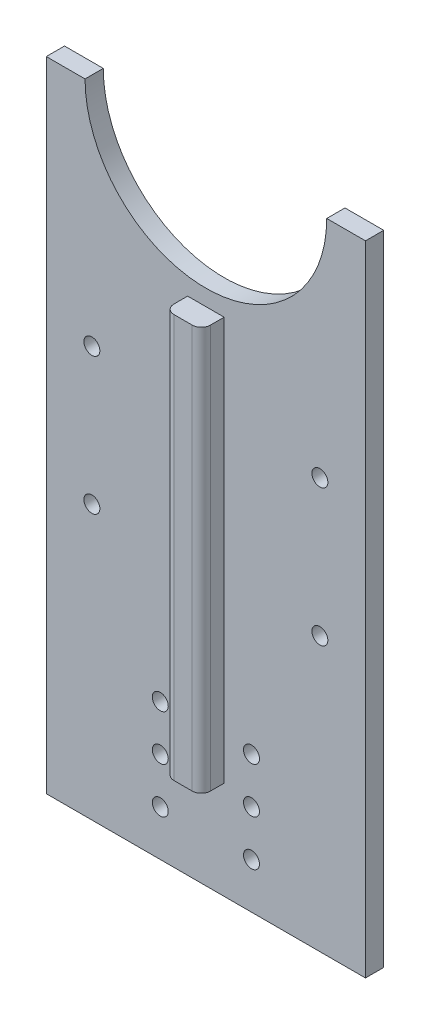
ISO-10303-21;
HEADER;
FILE_DESCRIPTION(('STEP AP214'),'2;1');
FILE_NAME('part.step','',(''),(''),'','','');
FILE_SCHEMA(('AUTOMOTIVE_DESIGN { 1 0 10303 214 1 1 1 1 }'));
ENDSEC;
DATA;
#1=APPLICATION_CONTEXT('core data for automotive mechanical design processes');
#2=APPLICATION_PROTOCOL_DEFINITION('international standard','automotive_design',2000,#1);
#3=PRODUCT_CONTEXT('',#1,'mechanical');
#4=PRODUCT('Part','Part','',(#3));
#5=PRODUCT_RELATED_PRODUCT_CATEGORY('part','',(#4));
#6=PRODUCT_DEFINITION_FORMATION('','',#4);
#7=PRODUCT_DEFINITION_CONTEXT('part definition',#1,'design');
#8=PRODUCT_DEFINITION('design','',#6,#7);
#9=PRODUCT_DEFINITION_SHAPE('','',#8);
#10=(LENGTH_UNIT() NAMED_UNIT(*) SI_UNIT(.MILLI.,.METRE.));
#11=(NAMED_UNIT(*) PLANE_ANGLE_UNIT() SI_UNIT($,.RADIAN.));
#12=(NAMED_UNIT(*) SI_UNIT($,.STERADIAN.) SOLID_ANGLE_UNIT());
#13=UNCERTAINTY_MEASURE_WITH_UNIT(LENGTH_MEASURE(1.E-05),#10,'distance_accuracy_value','');
#14=(GEOMETRIC_REPRESENTATION_CONTEXT(3) GLOBAL_UNCERTAINTY_ASSIGNED_CONTEXT((#13)) GLOBAL_UNIT_ASSIGNED_CONTEXT((#10,
#11,#12)) REPRESENTATION_CONTEXT('',''));
#15=CARTESIAN_POINT('',(0.,0.,0.));
#16=DIRECTION('',(0.,0.,1.));
#17=DIRECTION('',(1.,0.,0.));
#18=AXIS2_PLACEMENT_3D('',#15,#16,#17);
#19=CARTESIAN_POINT('',(0.,140.,4.));
#20=DIRECTION('',(0.,0.,1.));
#21=DIRECTION('',(1.,0.,0.));
#22=AXIS2_PLACEMENT_3D('',#19,#20,#21);
#23=PLANE('',#22);
#24=CARTESIAN_POINT('',(-25.,90.,4.));
#25=DIRECTION('',(0.,0.,1.));
#26=DIRECTION('',(1.,0.,0.));
#27=AXIS2_PLACEMENT_3D('',#24,#25,#26);
#28=CIRCLE('',#27,1.75);
#29=CARTESIAN_POINT('',(-23.25,90.,4.));
#30=VERTEX_POINT('',#29);
#31=EDGE_CURVE('E341',#30,#30,#28,.T.);
#32=ORIENTED_EDGE('',*,*,#31,.F.);
#33=EDGE_LOOP('',(#32));
#34=FACE_BOUND('',#33,.T.);
#35=CARTESIAN_POINT('',(25.,90.,4.));
#36=DIRECTION('',(0.,0.,1.));
#37=DIRECTION('',(1.,0.,0.));
#38=AXIS2_PLACEMENT_3D('',#35,#36,#37);
#39=CIRCLE('',#38,1.75);
#40=CARTESIAN_POINT('',(26.75,90.,4.));
#41=VERTEX_POINT('',#40);
#42=EDGE_CURVE('E333',#41,#41,#39,.T.);
#43=ORIENTED_EDGE('',*,*,#42,.F.);
#44=EDGE_LOOP('',(#43));
#45=FACE_BOUND('',#44,.T.);
#46=DIRECTION('',(0.,-1.,0.));
#47=VECTOR('',#46,1.);
#48=CARTESIAN_POINT('',(-4.,21.5,4.));
#49=LINE('',#48,#47);
#50=CARTESIAN_POINT('',(-4.,110.,4.));
#51=VERTEX_POINT('',#50);
#52=CARTESIAN_POINT('',(-4.,21.5,4.));
#53=VERTEX_POINT('',#52);
#54=EDGE_CURVE('E155',#51,#53,#49,.T.);
#55=ORIENTED_EDGE('',*,*,#54,.F.);
#56=DIRECTION('',(-1.,0.,0.));
#57=VECTOR('',#56,1.);
#58=CARTESIAN_POINT('',(-4.,110.,4.));
#59=LINE('',#58,#57);
#60=CARTESIAN_POINT('',(4.,110.,4.));
#61=VERTEX_POINT('',#60);
#62=EDGE_CURVE('E149',#61,#51,#59,.T.);
#63=ORIENTED_EDGE('',*,*,#62,.F.);
#64=DIRECTION('',(0.,1.,0.));
#65=VECTOR('',#64,1.);
#66=CARTESIAN_POINT('',(4.,21.5,4.));
#67=LINE('',#66,#65);
#68=CARTESIAN_POINT('',(4.,21.5,4.));
#69=VERTEX_POINT('',#68);
#70=EDGE_CURVE('E132',#69,#61,#67,.T.);
#71=ORIENTED_EDGE('',*,*,#70,.F.);
#72=DIRECTION('',(1.,0.,0.));
#73=VECTOR('',#72,1.);
#74=CARTESIAN_POINT('',(-4.,21.5,4.));
#75=LINE('',#74,#73);
#76=EDGE_CURVE('E146',#53,#69,#75,.T.);
#77=ORIENTED_EDGE('',*,*,#76,.F.);
#78=EDGE_LOOP('',(#55,#63,#71,#77));
#79=FACE_BOUND('',#78,.T.);
#80=CARTESIAN_POINT('',(10.,30.,4.));
#81=DIRECTION('',(0.,0.,1.));
#82=DIRECTION('',(1.,0.,0.));
#83=AXIS2_PLACEMENT_3D('',#80,#81,#82);
#84=CIRCLE('',#83,1.75);
#85=CARTESIAN_POINT('',(11.75,30.,4.));
#86=VERTEX_POINT('',#85);
#87=EDGE_CURVE('E182',#86,#86,#84,.T.);
#88=ORIENTED_EDGE('',*,*,#87,.F.);
#89=EDGE_LOOP('',(#88));
#90=FACE_BOUND('',#89,.T.);
#91=CARTESIAN_POINT('',(10.,20.,4.));
#92=DIRECTION('',(0.,0.,1.));
#93=DIRECTION('',(1.,0.,0.));
#94=AXIS2_PLACEMENT_3D('',#91,#92,#93);
#95=CIRCLE('',#94,1.75);
#96=CARTESIAN_POINT('',(11.75,20.,4.));
#97=VERTEX_POINT('',#96);
#98=EDGE_CURVE('E198',#97,#97,#95,.T.);
#99=ORIENTED_EDGE('',*,*,#98,.F.);
#100=EDGE_LOOP('',(#99));
#101=FACE_BOUND('',#100,.T.);
#102=CARTESIAN_POINT('',(-10.,10.,4.));
#103=DIRECTION('',(0.,0.,1.));
#104=DIRECTION('',(1.,0.,0.));
#105=AXIS2_PLACEMENT_3D('',#102,#103,#104);
#106=CIRCLE('',#105,1.75);
#107=CARTESIAN_POINT('',(-8.25,10.,4.));
#108=VERTEX_POINT('',#107);
#109=EDGE_CURVE('E214',#108,#108,#106,.T.);
#110=ORIENTED_EDGE('',*,*,#109,.F.);
#111=EDGE_LOOP('',(#110));
#112=FACE_BOUND('',#111,.T.);
#113=CARTESIAN_POINT('',(-25.,60.,4.));
#114=DIRECTION('',(0.,0.,1.));
#115=DIRECTION('',(1.,0.,0.));
#116=AXIS2_PLACEMENT_3D('',#113,#114,#115);
#117=CIRCLE('',#116,1.75);
#118=CARTESIAN_POINT('',(-23.25,60.,4.));
#119=VERTEX_POINT('',#118);
#120=EDGE_CURVE('E230',#119,#119,#117,.T.);
#121=ORIENTED_EDGE('',*,*,#120,.F.);
#122=EDGE_LOOP('',(#121));
#123=FACE_BOUND('',#122,.T.);
#124=DIRECTION('',(0.,-1.,0.));
#125=VECTOR('',#124,1.);
#126=CARTESIAN_POINT('',(-35.,0.,4.));
#127=LINE('',#126,#125);
#128=CARTESIAN_POINT('',(-35.,140.,4.));
#129=VERTEX_POINT('',#128);
#130=CARTESIAN_POINT('',(-35.,0.,4.));
#131=VERTEX_POINT('',#130);
#132=EDGE_CURVE('E238',#129,#131,#127,.T.);
#133=ORIENTED_EDGE('',*,*,#132,.T.);
#134=DIRECTION('',(1.,0.,0.));
#135=VECTOR('',#134,1.);
#136=CARTESIAN_POINT('',(-35.,0.,4.));
#137=LINE('',#136,#135);
#138=CARTESIAN_POINT('',(35.,0.,4.));
#139=VERTEX_POINT('',#138);
#140=EDGE_CURVE('E242',#131,#139,#137,.T.);
#141=ORIENTED_EDGE('',*,*,#140,.T.);
#142=DIRECTION('',(0.,1.,0.));
#143=VECTOR('',#142,1.);
#144=CARTESIAN_POINT('',(35.,0.,4.));
#145=LINE('',#144,#143);
#146=CARTESIAN_POINT('',(35.,140.,4.));
#147=VERTEX_POINT('',#146);
#148=EDGE_CURVE('E246',#139,#147,#145,.T.);
#149=ORIENTED_EDGE('',*,*,#148,.T.);
#150=DIRECTION('',(-1.,0.,0.));
#151=VECTOR('',#150,1.);
#152=CARTESIAN_POINT('',(26.5,140.,4.));
#153=LINE('',#152,#151);
#154=CARTESIAN_POINT('',(26.5,140.,4.));
#155=VERTEX_POINT('',#154);
#156=EDGE_CURVE('E249',#147,#155,#153,.T.);
#157=ORIENTED_EDGE('',*,*,#156,.T.);
#158=CARTESIAN_POINT('',(0.,140.,4.));
#159=DIRECTION('',(0.,0.,-1.));
#160=DIRECTION('',(1.,0.,0.));
#161=AXIS2_PLACEMENT_3D('',#158,#159,#160);
#162=CIRCLE('',#161,26.5);
#163=CARTESIAN_POINT('',(-26.5,140.,4.));
#164=VERTEX_POINT('',#163);
#165=EDGE_CURVE('E252',#155,#164,#162,.T.);
#166=ORIENTED_EDGE('',*,*,#165,.T.);
#167=DIRECTION('',(-1.,0.,0.));
#168=VECTOR('',#167,1.);
#169=CARTESIAN_POINT('',(-26.5,140.,4.));
#170=LINE('',#169,#168);
#171=EDGE_CURVE('E255',#164,#129,#170,.T.);
#172=ORIENTED_EDGE('',*,*,#171,.T.);
#173=EDGE_LOOP('',(#133,#141,#149,#157,#166,#172));
#174=FACE_BOUND('',#173,.T.);
#175=CARTESIAN_POINT('',(25.,60.,4.));
#176=DIRECTION('',(0.,0.,1.));
#177=DIRECTION('',(1.,0.,0.));
#178=AXIS2_PLACEMENT_3D('',#175,#176,#177);
#179=CIRCLE('',#178,1.75);
#180=CARTESIAN_POINT('',(26.75,60.,4.));
#181=VERTEX_POINT('',#180);
#182=EDGE_CURVE('E222',#181,#181,#179,.T.);
#183=ORIENTED_EDGE('',*,*,#182,.F.);
#184=EDGE_LOOP('',(#183));
#185=FACE_BOUND('',#184,.T.);
#186=CARTESIAN_POINT('',(10.,10.,4.));
#187=DIRECTION('',(0.,0.,1.));
#188=DIRECTION('',(1.,0.,0.));
#189=AXIS2_PLACEMENT_3D('',#186,#187,#188);
#190=CIRCLE('',#189,1.75);
#191=CARTESIAN_POINT('',(11.75,10.,4.));
#192=VERTEX_POINT('',#191);
#193=EDGE_CURVE('E206',#192,#192,#190,.T.);
#194=ORIENTED_EDGE('',*,*,#193,.F.);
#195=EDGE_LOOP('',(#194));
#196=FACE_BOUND('',#195,.T.);
#197=CARTESIAN_POINT('',(-10.,20.,4.));
#198=DIRECTION('',(0.,0.,1.));
#199=DIRECTION('',(1.,0.,0.));
#200=AXIS2_PLACEMENT_3D('',#197,#198,#199);
#201=CIRCLE('',#200,1.75);
#202=CARTESIAN_POINT('',(-8.25,20.,4.));
#203=VERTEX_POINT('',#202);
#204=EDGE_CURVE('E190',#203,#203,#201,.T.);
#205=ORIENTED_EDGE('',*,*,#204,.F.);
#206=EDGE_LOOP('',(#205));
#207=FACE_BOUND('',#206,.T.);
#208=CARTESIAN_POINT('',(-10.,30.,4.));
#209=DIRECTION('',(0.,0.,1.));
#210=DIRECTION('',(1.,0.,0.));
#211=AXIS2_PLACEMENT_3D('',#208,#209,#210);
#212=CIRCLE('',#211,1.75);
#213=CARTESIAN_POINT('',(-8.25,30.,4.));
#214=VERTEX_POINT('',#213);
#215=EDGE_CURVE('E174',#214,#214,#212,.T.);
#216=ORIENTED_EDGE('',*,*,#215,.F.);
#217=EDGE_LOOP('',(#216));
#218=FACE_BOUND('',#217,.T.);
#219=ADVANCED_FACE('F39',(#34,#45,#79,#90,#101,#112,#123,#174,#185,#196,#207,#218),#23,.T.);
#220=CARTESIAN_POINT('',(0.,140.,0.));
#221=DIRECTION('',(0.,0.,1.));
#222=DIRECTION('',(1.,0.,0.));
#223=AXIS2_PLACEMENT_3D('',#220,#221,#222);
#224=PLANE('',#223);
#225=CARTESIAN_POINT('',(-25.,90.,0.));
#226=DIRECTION('',(0.,0.,1.));
#227=DIRECTION('',(1.,0.,0.));
#228=AXIS2_PLACEMENT_3D('',#225,#226,#227);
#229=CIRCLE('',#228,1.75);
#230=CARTESIAN_POINT('',(-23.25,90.,0.));
#231=VERTEX_POINT('',#230);
#232=EDGE_CURVE('E158',#231,#231,#229,.T.);
#233=ORIENTED_EDGE('',*,*,#232,.T.);
#234=EDGE_LOOP('',(#233));
#235=FACE_BOUND('',#234,.T.);
#236=CARTESIAN_POINT('',(25.,90.,0.));
#237=DIRECTION('',(0.,0.,1.));
#238=DIRECTION('',(1.,0.,0.));
#239=AXIS2_PLACEMENT_3D('',#236,#237,#238);
#240=CIRCLE('',#239,1.75);
#241=CARTESIAN_POINT('',(26.75,90.,0.));
#242=VERTEX_POINT('',#241);
#243=EDGE_CURVE('E337',#242,#242,#240,.T.);
#244=ORIENTED_EDGE('',*,*,#243,.T.);
#245=EDGE_LOOP('',(#244));
#246=FACE_BOUND('',#245,.T.);
#247=DIRECTION('',(0.,-1.,0.));
#248=VECTOR('',#247,1.);
#249=CARTESIAN_POINT('',(-35.,0.,0.));
#250=LINE('',#249,#248);
#251=CARTESIAN_POINT('',(-35.,140.,0.));
#252=VERTEX_POINT('',#251);
#253=CARTESIAN_POINT('',(-35.,0.,0.));
#254=VERTEX_POINT('',#253);
#255=EDGE_CURVE('E234',#252,#254,#250,.T.);
#256=ORIENTED_EDGE('',*,*,#255,.F.);
#257=DIRECTION('',(-1.,0.,0.));
#258=VECTOR('',#257,1.);
#259=CARTESIAN_POINT('',(-26.5,140.,0.));
#260=LINE('',#259,#258);
#261=CARTESIAN_POINT('',(-26.5,140.,0.));
#262=VERTEX_POINT('',#261);
#263=EDGE_CURVE('E243',#262,#252,#260,.T.);
#264=ORIENTED_EDGE('',*,*,#263,.F.);
#265=CARTESIAN_POINT('',(0.,140.,0.));
#266=DIRECTION('',(0.,0.,-1.));
#267=DIRECTION('',(1.,0.,0.));
#268=AXIS2_PLACEMENT_3D('',#265,#266,#267);
#269=CIRCLE('',#268,26.5);
#270=CARTESIAN_POINT('',(26.5,140.,0.));
#271=VERTEX_POINT('',#270);
#272=EDGE_CURVE('E271',#271,#262,#269,.T.);
#273=ORIENTED_EDGE('',*,*,#272,.F.);
#274=DIRECTION('',(-1.,0.,0.));
#275=VECTOR('',#274,1.);
#276=CARTESIAN_POINT('',(26.5,140.,0.));
#277=LINE('',#276,#275);
#278=CARTESIAN_POINT('',(35.,140.,0.));
#279=VERTEX_POINT('',#278);
#280=EDGE_CURVE('E268',#279,#271,#277,.T.);
#281=ORIENTED_EDGE('',*,*,#280,.F.);
#282=DIRECTION('',(0.,1.,0.));
#283=VECTOR('',#282,1.);
#284=CARTESIAN_POINT('',(35.,0.,0.));
#285=LINE('',#284,#283);
#286=CARTESIAN_POINT('',(35.,0.,0.));
#287=VERTEX_POINT('',#286);
#288=EDGE_CURVE('E265',#287,#279,#285,.T.);
#289=ORIENTED_EDGE('',*,*,#288,.F.);
#290=DIRECTION('',(1.,0.,0.));
#291=VECTOR('',#290,1.);
#292=CARTESIAN_POINT('',(-35.,0.,0.));
#293=LINE('',#292,#291);
#294=EDGE_CURVE('E262',#254,#287,#293,.T.);
#295=ORIENTED_EDGE('',*,*,#294,.F.);
#296=EDGE_LOOP('',(#256,#264,#273,#281,#289,#295));
#297=FACE_BOUND('',#296,.T.);
#298=CARTESIAN_POINT('',(-25.,60.,0.));
#299=DIRECTION('',(0.,0.,1.));
#300=DIRECTION('',(1.,0.,0.));
#301=AXIS2_PLACEMENT_3D('',#298,#299,#300);
#302=CIRCLE('',#301,1.75);
#303=CARTESIAN_POINT('',(-23.25,60.,0.));
#304=VERTEX_POINT('',#303);
#305=EDGE_CURVE('E226',#304,#304,#302,.T.);
#306=ORIENTED_EDGE('',*,*,#305,.T.);
#307=EDGE_LOOP('',(#306));
#308=FACE_BOUND('',#307,.T.);
#309=CARTESIAN_POINT('',(25.,60.,0.));
#310=DIRECTION('',(0.,0.,1.));
#311=DIRECTION('',(1.,0.,0.));
#312=AXIS2_PLACEMENT_3D('',#309,#310,#311);
#313=CIRCLE('',#312,1.75);
#314=CARTESIAN_POINT('',(26.75,60.,0.));
#315=VERTEX_POINT('',#314);
#316=EDGE_CURVE('E218',#315,#315,#313,.T.);
#317=ORIENTED_EDGE('',*,*,#316,.T.);
#318=EDGE_LOOP('',(#317));
#319=FACE_BOUND('',#318,.T.);
#320=CARTESIAN_POINT('',(-10.,10.,0.));
#321=DIRECTION('',(0.,0.,1.));
#322=DIRECTION('',(1.,0.,0.));
#323=AXIS2_PLACEMENT_3D('',#320,#321,#322);
#324=CIRCLE('',#323,1.75);
#325=CARTESIAN_POINT('',(-8.25,10.,0.));
#326=VERTEX_POINT('',#325);
#327=EDGE_CURVE('E210',#326,#326,#324,.T.);
#328=ORIENTED_EDGE('',*,*,#327,.T.);
#329=EDGE_LOOP('',(#328));
#330=FACE_BOUND('',#329,.T.);
#331=CARTESIAN_POINT('',(10.,10.,0.));
#332=DIRECTION('',(0.,0.,1.));
#333=DIRECTION('',(1.,0.,0.));
#334=AXIS2_PLACEMENT_3D('',#331,#332,#333);
#335=CIRCLE('',#334,1.75);
#336=CARTESIAN_POINT('',(11.75,10.,0.));
#337=VERTEX_POINT('',#336);
#338=EDGE_CURVE('E202',#337,#337,#335,.T.);
#339=ORIENTED_EDGE('',*,*,#338,.T.);
#340=EDGE_LOOP('',(#339));
#341=FACE_BOUND('',#340,.T.);
#342=CARTESIAN_POINT('',(10.,20.,0.));
#343=DIRECTION('',(0.,0.,1.));
#344=DIRECTION('',(1.,0.,0.));
#345=AXIS2_PLACEMENT_3D('',#342,#343,#344);
#346=CIRCLE('',#345,1.75);
#347=CARTESIAN_POINT('',(11.75,20.,0.));
#348=VERTEX_POINT('',#347);
#349=EDGE_CURVE('E194',#348,#348,#346,.T.);
#350=ORIENTED_EDGE('',*,*,#349,.T.);
#351=EDGE_LOOP('',(#350));
#352=FACE_BOUND('',#351,.T.);
#353=CARTESIAN_POINT('',(-10.,20.,0.));
#354=DIRECTION('',(0.,0.,1.));
#355=DIRECTION('',(1.,0.,0.));
#356=AXIS2_PLACEMENT_3D('',#353,#354,#355);
#357=CIRCLE('',#356,1.75);
#358=CARTESIAN_POINT('',(-8.25,20.,0.));
#359=VERTEX_POINT('',#358);
#360=EDGE_CURVE('E186',#359,#359,#357,.T.);
#361=ORIENTED_EDGE('',*,*,#360,.T.);
#362=EDGE_LOOP('',(#361));
#363=FACE_BOUND('',#362,.T.);
#364=CARTESIAN_POINT('',(10.,30.,0.));
#365=DIRECTION('',(0.,0.,1.));
#366=DIRECTION('',(1.,0.,0.));
#367=AXIS2_PLACEMENT_3D('',#364,#365,#366);
#368=CIRCLE('',#367,1.75);
#369=CARTESIAN_POINT('',(11.75,30.,0.));
#370=VERTEX_POINT('',#369);
#371=EDGE_CURVE('E178',#370,#370,#368,.T.);
#372=ORIENTED_EDGE('',*,*,#371,.T.);
#373=EDGE_LOOP('',(#372));
#374=FACE_BOUND('',#373,.T.);
#375=CARTESIAN_POINT('',(-10.,30.,0.));
#376=DIRECTION('',(0.,0.,1.));
#377=DIRECTION('',(1.,0.,0.));
#378=AXIS2_PLACEMENT_3D('',#375,#376,#377);
#379=CIRCLE('',#378,1.75);
#380=CARTESIAN_POINT('',(-8.25,30.,0.));
#381=VERTEX_POINT('',#380);
#382=EDGE_CURVE('E173',#381,#381,#379,.T.);
#383=ORIENTED_EDGE('',*,*,#382,.T.);
#384=EDGE_LOOP('',(#383));
#385=FACE_BOUND('',#384,.T.);
#386=ADVANCED_FACE('F349',(#235,#246,#297,#308,#319,#330,#341,#352,#363,#374,#385),#224,.F.);
#387=CARTESIAN_POINT('',(-35.,0.,4.));
#388=DIRECTION('',(1.,0.,0.));
#389=DIRECTION('',(0.,0.,-1.));
#390=AXIS2_PLACEMENT_3D('',#387,#388,#389);
#391=PLANE('',#390);
#392=ORIENTED_EDGE('',*,*,#255,.T.);
#393=DIRECTION('',(0.,0.,-1.));
#394=VECTOR('',#393,1.);
#395=CARTESIAN_POINT('',(-35.,0.,4.));
#396=LINE('',#395,#394);
#397=EDGE_CURVE('E295',#131,#254,#396,.T.);
#398=ORIENTED_EDGE('',*,*,#397,.F.);
#399=ORIENTED_EDGE('',*,*,#132,.F.);
#400=DIRECTION('',(0.,0.,-1.));
#401=VECTOR('',#400,1.);
#402=CARTESIAN_POINT('',(-35.,140.,4.));
#403=LINE('',#402,#401);
#404=EDGE_CURVE('E258',#129,#252,#403,.T.);
#405=ORIENTED_EDGE('',*,*,#404,.T.);
#406=EDGE_LOOP('',(#392,#398,#399,#405));
#407=FACE_BOUND('',#406,.T.);
#408=ADVANCED_FACE('F417',(#407),#391,.F.);
#409=CARTESIAN_POINT('',(-35.,0.,4.));
#410=DIRECTION('',(0.,1.,0.));
#411=DIRECTION('',(0.,0.,1.));
#412=AXIS2_PLACEMENT_3D('',#409,#410,#411);
#413=PLANE('',#412);
#414=ORIENTED_EDGE('',*,*,#294,.T.);
#415=DIRECTION('',(0.,0.,-1.));
#416=VECTOR('',#415,1.);
#417=CARTESIAN_POINT('',(35.,0.,4.));
#418=LINE('',#417,#416);
#419=EDGE_CURVE('E291',#139,#287,#418,.T.);
#420=ORIENTED_EDGE('',*,*,#419,.F.);
#421=ORIENTED_EDGE('',*,*,#140,.F.);
#422=ORIENTED_EDGE('',*,*,#397,.T.);
#423=EDGE_LOOP('',(#414,#420,#421,#422));
#424=FACE_BOUND('',#423,.T.);
#425=ADVANCED_FACE('F432',(#424),#413,.F.);
#426=CARTESIAN_POINT('',(35.,0.,4.));
#427=DIRECTION('',(-1.,0.,0.));
#428=DIRECTION('',(0.,0.,1.));
#429=AXIS2_PLACEMENT_3D('',#426,#427,#428);
#430=PLANE('',#429);
#431=ORIENTED_EDGE('',*,*,#288,.T.);
#432=DIRECTION('',(0.,0.,-1.));
#433=VECTOR('',#432,1.);
#434=CARTESIAN_POINT('',(35.,140.,4.));
#435=LINE('',#434,#433);
#436=EDGE_CURVE('E287',#147,#279,#435,.T.);
#437=ORIENTED_EDGE('',*,*,#436,.F.);
#438=ORIENTED_EDGE('',*,*,#148,.F.);
#439=ORIENTED_EDGE('',*,*,#419,.T.);
#440=EDGE_LOOP('',(#431,#437,#438,#439));
#441=FACE_BOUND('',#440,.T.);
#442=ADVANCED_FACE('F428',(#441),#430,.F.);
#443=CARTESIAN_POINT('',(26.5,140.,4.));
#444=DIRECTION('',(0.,-1.,0.));
#445=DIRECTION('',(0.,0.,-1.));
#446=AXIS2_PLACEMENT_3D('',#443,#444,#445);
#447=PLANE('',#446);
#448=ORIENTED_EDGE('',*,*,#280,.T.);
#449=DIRECTION('',(0.,0.,-1.));
#450=VECTOR('',#449,1.);
#451=CARTESIAN_POINT('',(26.5,140.,4.));
#452=LINE('',#451,#450);
#453=EDGE_CURVE('E283',#155,#271,#452,.T.);
#454=ORIENTED_EDGE('',*,*,#453,.F.);
#455=ORIENTED_EDGE('',*,*,#156,.F.);
#456=ORIENTED_EDGE('',*,*,#436,.T.);
#457=EDGE_LOOP('',(#448,#454,#455,#456));
#458=FACE_BOUND('',#457,.T.);
#459=ADVANCED_FACE('F424',(#458),#447,.F.);
#460=CARTESIAN_POINT('',(0.,140.,4.));
#461=DIRECTION('',(0.,0.,-1.));
#462=DIRECTION('',(-1.,0.,0.));
#463=AXIS2_PLACEMENT_3D('',#460,#461,#462);
#464=CYLINDRICAL_SURFACE('',#463,26.5);
#465=ORIENTED_EDGE('',*,*,#272,.T.);
#466=DIRECTION('',(0.,0.,-1.));
#467=VECTOR('',#466,1.);
#468=CARTESIAN_POINT('',(-26.5,140.,4.));
#469=LINE('',#468,#467);
#470=EDGE_CURVE('E279',#164,#262,#469,.T.);
#471=ORIENTED_EDGE('',*,*,#470,.F.);
#472=ORIENTED_EDGE('',*,*,#165,.F.);
#473=ORIENTED_EDGE('',*,*,#453,.T.);
#474=EDGE_LOOP('',(#465,#471,#472,#473));
#475=FACE_BOUND('',#474,.T.);
#476=ADVANCED_FACE('F420',(#475),#464,.F.);
#477=CARTESIAN_POINT('',(-26.5,140.,4.));
#478=DIRECTION('',(0.,-1.,0.));
#479=DIRECTION('',(0.,0.,-1.));
#480=AXIS2_PLACEMENT_3D('',#477,#478,#479);
#481=PLANE('',#480);
#482=ORIENTED_EDGE('',*,*,#263,.T.);
#483=ORIENTED_EDGE('',*,*,#404,.F.);
#484=ORIENTED_EDGE('',*,*,#171,.F.);
#485=ORIENTED_EDGE('',*,*,#470,.T.);
#486=EDGE_LOOP('',(#482,#483,#484,#485));
#487=FACE_BOUND('',#486,.T.);
#488=ADVANCED_FACE('F412',(#487),#481,.F.);
#489=CARTESIAN_POINT('',(-25.,60.,4.));
#490=DIRECTION('',(0.,0.,-1.));
#491=DIRECTION('',(-1.,0.,0.));
#492=AXIS2_PLACEMENT_3D('',#489,#490,#491);
#493=CYLINDRICAL_SURFACE('',#492,1.75);
#494=ORIENTED_EDGE('',*,*,#120,.T.);
#495=EDGE_LOOP('',(#494));
#496=FACE_BOUND('',#495,.T.);
#497=ORIENTED_EDGE('',*,*,#305,.F.);
#498=EDGE_LOOP('',(#497));
#499=FACE_BOUND('',#498,.T.);
#500=ADVANCED_FACE('F409',(#496,#499),#493,.F.);
#501=CARTESIAN_POINT('',(25.,60.,4.));
#502=DIRECTION('',(0.,0.,-1.));
#503=DIRECTION('',(-1.,0.,0.));
#504=AXIS2_PLACEMENT_3D('',#501,#502,#503);
#505=CYLINDRICAL_SURFACE('',#504,1.75);
#506=ORIENTED_EDGE('',*,*,#182,.T.);
#507=EDGE_LOOP('',(#506));
#508=FACE_BOUND('',#507,.T.);
#509=ORIENTED_EDGE('',*,*,#316,.F.);
#510=EDGE_LOOP('',(#509));
#511=FACE_BOUND('',#510,.T.);
#512=ADVANCED_FACE('F405',(#508,#511),#505,.F.);
#513=CARTESIAN_POINT('',(-10.,10.,4.));
#514=DIRECTION('',(0.,0.,-1.));
#515=DIRECTION('',(-1.,0.,0.));
#516=AXIS2_PLACEMENT_3D('',#513,#514,#515);
#517=CYLINDRICAL_SURFACE('',#516,1.75);
#518=ORIENTED_EDGE('',*,*,#109,.T.);
#519=EDGE_LOOP('',(#518));
#520=FACE_BOUND('',#519,.T.);
#521=ORIENTED_EDGE('',*,*,#327,.F.);
#522=EDGE_LOOP('',(#521));
#523=FACE_BOUND('',#522,.T.);
#524=ADVANCED_FACE('F401',(#520,#523),#517,.F.);
#525=CARTESIAN_POINT('',(10.,10.,4.));
#526=DIRECTION('',(0.,0.,-1.));
#527=DIRECTION('',(-1.,0.,0.));
#528=AXIS2_PLACEMENT_3D('',#525,#526,#527);
#529=CYLINDRICAL_SURFACE('',#528,1.75);
#530=ORIENTED_EDGE('',*,*,#193,.T.);
#531=EDGE_LOOP('',(#530));
#532=FACE_BOUND('',#531,.T.);
#533=ORIENTED_EDGE('',*,*,#338,.F.);
#534=EDGE_LOOP('',(#533));
#535=FACE_BOUND('',#534,.T.);
#536=ADVANCED_FACE('F397',(#532,#535),#529,.F.);
#537=CARTESIAN_POINT('',(10.,20.,4.));
#538=DIRECTION('',(0.,0.,-1.));
#539=DIRECTION('',(-1.,0.,0.));
#540=AXIS2_PLACEMENT_3D('',#537,#538,#539);
#541=CYLINDRICAL_SURFACE('',#540,1.75);
#542=ORIENTED_EDGE('',*,*,#98,.T.);
#543=EDGE_LOOP('',(#542));
#544=FACE_BOUND('',#543,.T.);
#545=ORIENTED_EDGE('',*,*,#349,.F.);
#546=EDGE_LOOP('',(#545));
#547=FACE_BOUND('',#546,.T.);
#548=ADVANCED_FACE('F393',(#544,#547),#541,.F.);
#549=CARTESIAN_POINT('',(-10.,20.,4.));
#550=DIRECTION('',(0.,0.,-1.));
#551=DIRECTION('',(-1.,0.,0.));
#552=AXIS2_PLACEMENT_3D('',#549,#550,#551);
#553=CYLINDRICAL_SURFACE('',#552,1.75);
#554=ORIENTED_EDGE('',*,*,#204,.T.);
#555=EDGE_LOOP('',(#554));
#556=FACE_BOUND('',#555,.T.);
#557=ORIENTED_EDGE('',*,*,#360,.F.);
#558=EDGE_LOOP('',(#557));
#559=FACE_BOUND('',#558,.T.);
#560=ADVANCED_FACE('F389',(#556,#559),#553,.F.);
#561=CARTESIAN_POINT('',(10.,30.,4.));
#562=DIRECTION('',(0.,0.,-1.));
#563=DIRECTION('',(-1.,0.,0.));
#564=AXIS2_PLACEMENT_3D('',#561,#562,#563);
#565=CYLINDRICAL_SURFACE('',#564,1.75);
#566=ORIENTED_EDGE('',*,*,#87,.T.);
#567=EDGE_LOOP('',(#566));
#568=FACE_BOUND('',#567,.T.);
#569=ORIENTED_EDGE('',*,*,#371,.F.);
#570=EDGE_LOOP('',(#569));
#571=FACE_BOUND('',#570,.T.);
#572=ADVANCED_FACE('F385',(#568,#571),#565,.F.);
#573=CARTESIAN_POINT('',(-10.,30.,4.));
#574=DIRECTION('',(0.,0.,-1.));
#575=DIRECTION('',(-1.,0.,0.));
#576=AXIS2_PLACEMENT_3D('',#573,#574,#575);
#577=CYLINDRICAL_SURFACE('',#576,1.75);
#578=ORIENTED_EDGE('',*,*,#215,.T.);
#579=EDGE_LOOP('',(#578));
#580=FACE_BOUND('',#579,.T.);
#581=ORIENTED_EDGE('',*,*,#382,.F.);
#582=EDGE_LOOP('',(#581));
#583=FACE_BOUND('',#582,.T.);
#584=ADVANCED_FACE('F382',(#580,#583),#577,.F.);
#585=CARTESIAN_POINT('',(-4.,21.5,9.));
#586=DIRECTION('',(1.,0.,0.));
#587=DIRECTION('',(0.,1.,0.));
#588=AXIS2_PLACEMENT_3D('',#585,#586,#587);
#589=PLANE('',#588);
#590=DIRECTION('',(0.,0.,-1.));
#591=VECTOR('',#590,1.);
#592=CARTESIAN_POINT('',(-4.,21.5,9.));
#593=LINE('',#592,#591);
#594=CARTESIAN_POINT('',(-4.,21.5,7.));
#595=VERTEX_POINT('',#594);
#596=EDGE_CURVE('E138',#595,#53,#593,.T.);
#597=ORIENTED_EDGE('',*,*,#596,.F.);
#598=DIRECTION('',(0.,-1.,0.));
#599=VECTOR('',#598,1.);
#600=CARTESIAN_POINT('',(-4.,21.5,7.));
#601=LINE('',#600,#599);
#602=CARTESIAN_POINT('',(-4.,110.,7.));
#603=VERTEX_POINT('',#602);
#604=EDGE_CURVE('E63',#595,#603,#601,.F.);
#605=ORIENTED_EDGE('',*,*,#604,.T.);
#606=DIRECTION('',(0.,0.,-1.));
#607=VECTOR('',#606,1.);
#608=CARTESIAN_POINT('',(-4.,110.,9.));
#609=LINE('',#608,#607);
#610=EDGE_CURVE('E165',#603,#51,#609,.T.);
#611=ORIENTED_EDGE('',*,*,#610,.T.);
#612=ORIENTED_EDGE('',*,*,#54,.T.);
#613=EDGE_LOOP('',(#597,#605,#611,#612));
#614=FACE_BOUND('',#613,.T.);
#615=ADVANCED_FACE('F328',(#614),#589,.F.);
#616=CARTESIAN_POINT('',(-4.,21.5,9.));
#617=DIRECTION('',(0.,1.,0.));
#618=DIRECTION('',(0.,0.,1.));
#619=AXIS2_PLACEMENT_3D('',#616,#617,#618);
#620=PLANE('',#619);
#621=DIRECTION('',(1.,0.,0.));
#622=VECTOR('',#621,1.);
#623=CARTESIAN_POINT('',(-4.,21.5,9.));
#624=LINE('',#623,#622);
#625=CARTESIAN_POINT('',(-2.,21.5,9.));
#626=VERTEX_POINT('',#625);
#627=CARTESIAN_POINT('',(2.,21.5,9.));
#628=VERTEX_POINT('',#627);
#629=EDGE_CURVE('E164',#626,#628,#624,.T.);
#630=ORIENTED_EDGE('',*,*,#629,.F.);
#631=CARTESIAN_POINT('',(-2.,21.5,7.));
#632=DIRECTION('',(0.,1.,0.));
#633=DIRECTION('',(0.,0.,1.));
#634=AXIS2_PLACEMENT_3D('',#631,#632,#633);
#635=CIRCLE('',#634,2.);
#636=EDGE_CURVE('E310',#626,#595,#635,.F.);
#637=ORIENTED_EDGE('',*,*,#636,.T.);
#638=ORIENTED_EDGE('',*,*,#596,.T.);
#639=ORIENTED_EDGE('',*,*,#76,.T.);
#640=DIRECTION('',(0.,0.,-1.));
#641=VECTOR('',#640,1.);
#642=CARTESIAN_POINT('',(4.,21.5,9.));
#643=LINE('',#642,#641);
#644=CARTESIAN_POINT('',(4.,21.5,7.));
#645=VERTEX_POINT('',#644);
#646=EDGE_CURVE('E129',#645,#69,#643,.T.);
#647=ORIENTED_EDGE('',*,*,#646,.F.);
#648=CARTESIAN_POINT('',(2.,21.5,7.));
#649=DIRECTION('',(0.,1.,0.));
#650=DIRECTION('',(0.,0.,1.));
#651=AXIS2_PLACEMENT_3D('',#648,#649,#650);
#652=CIRCLE('',#651,2.);
#653=EDGE_CURVE('E307',#645,#628,#652,.F.);
#654=ORIENTED_EDGE('',*,*,#653,.T.);
#655=EDGE_LOOP('',(#630,#637,#638,#639,#647,#654));
#656=FACE_BOUND('',#655,.T.);
#657=ADVANCED_FACE('F153',(#656),#620,.F.);
#658=CARTESIAN_POINT('',(4.,21.5,9.));
#659=DIRECTION('',(-1.,0.,0.));
#660=DIRECTION('',(0.,-1.,0.));
#661=AXIS2_PLACEMENT_3D('',#658,#659,#660);
#662=PLANE('',#661);
#663=DIRECTION('',(0.,0.,-1.));
#664=VECTOR('',#663,1.);
#665=CARTESIAN_POINT('',(4.,110.,9.));
#666=LINE('',#665,#664);
#667=CARTESIAN_POINT('',(4.,110.,7.));
#668=VERTEX_POINT('',#667);
#669=EDGE_CURVE('E139',#668,#61,#666,.T.);
#670=ORIENTED_EDGE('',*,*,#669,.F.);
#671=DIRECTION('',(0.,1.,0.));
#672=VECTOR('',#671,1.);
#673=CARTESIAN_POINT('',(4.,21.5,7.));
#674=LINE('',#673,#672);
#675=EDGE_CURVE('E11',#668,#645,#674,.F.);
#676=ORIENTED_EDGE('',*,*,#675,.T.);
#677=ORIENTED_EDGE('',*,*,#646,.T.);
#678=ORIENTED_EDGE('',*,*,#70,.T.);
#679=EDGE_LOOP('',(#670,#676,#677,#678));
#680=FACE_BOUND('',#679,.T.);
#681=ADVANCED_FACE('F131',(#680),#662,.F.);
#682=CARTESIAN_POINT('',(-4.,110.,9.));
#683=DIRECTION('',(0.,-1.,0.));
#684=DIRECTION('',(0.,0.,-1.));
#685=AXIS2_PLACEMENT_3D('',#682,#683,#684);
#686=PLANE('',#685);
#687=ORIENTED_EDGE('',*,*,#610,.F.);
#688=CARTESIAN_POINT('',(-2.,110.,7.));
#689=DIRECTION('',(0.,-1.,0.));
#690=DIRECTION('',(0.,0.,-1.));
#691=AXIS2_PLACEMENT_3D('',#688,#689,#690);
#692=CIRCLE('',#691,2.);
#693=CARTESIAN_POINT('',(-2.,110.,9.));
#694=VERTEX_POINT('',#693);
#695=EDGE_CURVE('E48',#603,#694,#692,.F.);
#696=ORIENTED_EDGE('',*,*,#695,.T.);
#697=DIRECTION('',(-1.,0.,0.));
#698=VECTOR('',#697,1.);
#699=CARTESIAN_POINT('',(-4.,110.,9.));
#700=LINE('',#699,#698);
#701=CARTESIAN_POINT('',(2.,110.,9.));
#702=VERTEX_POINT('',#701);
#703=EDGE_CURVE('E168',#702,#694,#700,.T.);
#704=ORIENTED_EDGE('',*,*,#703,.F.);
#705=CARTESIAN_POINT('',(2.,110.,7.));
#706=DIRECTION('',(0.,-1.,0.));
#707=DIRECTION('',(0.,0.,-1.));
#708=AXIS2_PLACEMENT_3D('',#705,#706,#707);
#709=CIRCLE('',#708,2.);
#710=EDGE_CURVE('E55',#702,#668,#709,.F.);
#711=ORIENTED_EDGE('',*,*,#710,.T.);
#712=ORIENTED_EDGE('',*,*,#669,.T.);
#713=ORIENTED_EDGE('',*,*,#62,.T.);
#714=EDGE_LOOP('',(#687,#696,#704,#711,#712,#713));
#715=FACE_BOUND('',#714,.T.);
#716=ADVANCED_FACE('F319',(#715),#686,.F.);
#717=CARTESIAN_POINT('',(0.,0.,9.));
#718=DIRECTION('',(0.,0.,-1.));
#719=DIRECTION('',(-1.,0.,0.));
#720=AXIS2_PLACEMENT_3D('',#717,#718,#719);
#721=PLANE('',#720);
#722=ORIENTED_EDGE('',*,*,#703,.T.);
#723=DIRECTION('',(0.,-1.,0.));
#724=VECTOR('',#723,1.);
#725=CARTESIAN_POINT('',(-2.,0.,9.));
#726=LINE('',#725,#724);
#727=EDGE_CURVE('E303',#694,#626,#726,.T.);
#728=ORIENTED_EDGE('',*,*,#727,.T.);
#729=ORIENTED_EDGE('',*,*,#629,.T.);
#730=DIRECTION('',(0.,1.,0.));
#731=VECTOR('',#730,1.);
#732=CARTESIAN_POINT('',(2.,0.,9.));
#733=LINE('',#732,#731);
#734=EDGE_CURVE('E299',#628,#702,#733,.T.);
#735=ORIENTED_EDGE('',*,*,#734,.T.);
#736=EDGE_LOOP('',(#722,#728,#729,#735));
#737=FACE_BOUND('',#736,.T.);
#738=ADVANCED_FACE('F323',(#737),#721,.F.);
#739=CARTESIAN_POINT('',(-2.,0.,7.));
#740=DIRECTION('',(0.,-1.,0.));
#741=DIRECTION('',(1.,0.,0.));
#742=AXIS2_PLACEMENT_3D('',#739,#740,#741);
#743=CYLINDRICAL_SURFACE('',#742,2.);
#744=ORIENTED_EDGE('',*,*,#695,.F.);
#745=ORIENTED_EDGE('',*,*,#604,.F.);
#746=ORIENTED_EDGE('',*,*,#636,.F.);
#747=ORIENTED_EDGE('',*,*,#727,.F.);
#748=EDGE_LOOP('',(#744,#745,#746,#747));
#749=FACE_BOUND('',#748,.T.);
#750=ADVANCED_FACE('F327',(#749),#743,.T.);
#751=CARTESIAN_POINT('',(2.,0.,7.));
#752=DIRECTION('',(0.,1.,0.));
#753=DIRECTION('',(-1.,0.,0.));
#754=AXIS2_PLACEMENT_3D('',#751,#752,#753);
#755=CYLINDRICAL_SURFACE('',#754,2.);
#756=ORIENTED_EDGE('',*,*,#653,.F.);
#757=ORIENTED_EDGE('',*,*,#675,.F.);
#758=ORIENTED_EDGE('',*,*,#710,.F.);
#759=ORIENTED_EDGE('',*,*,#734,.F.);
#760=EDGE_LOOP('',(#756,#757,#758,#759));
#761=FACE_BOUND('',#760,.T.);
#762=ADVANCED_FACE('F41',(#761),#755,.T.);
#763=CARTESIAN_POINT('',(25.,90.,0.));
#764=DIRECTION('',(0.,0.,1.));
#765=DIRECTION('',(1.,0.,0.));
#766=AXIS2_PLACEMENT_3D('',#763,#764,#765);
#767=CYLINDRICAL_SURFACE('',#766,1.75);
#768=ORIENTED_EDGE('',*,*,#243,.F.);
#769=EDGE_LOOP('',(#768));
#770=FACE_BOUND('',#769,.T.);
#771=ORIENTED_EDGE('',*,*,#42,.T.);
#772=EDGE_LOOP('',(#771));
#773=FACE_BOUND('',#772,.T.);
#774=ADVANCED_FACE('F355',(#770,#773),#767,.F.);
#775=CARTESIAN_POINT('',(-25.,90.,0.));
#776=DIRECTION('',(0.,0.,1.));
#777=DIRECTION('',(1.,0.,0.));
#778=AXIS2_PLACEMENT_3D('',#775,#776,#777);
#779=CYLINDRICAL_SURFACE('',#778,1.75);
#780=ORIENTED_EDGE('',*,*,#232,.F.);
#781=EDGE_LOOP('',(#780));
#782=FACE_BOUND('',#781,.T.);
#783=ORIENTED_EDGE('',*,*,#31,.T.);
#784=EDGE_LOOP('',(#783));
#785=FACE_BOUND('',#784,.T.);
#786=ADVANCED_FACE('F352',(#782,#785),#779,.F.);
#787=CLOSED_SHELL('',(#219,#386,#408,#425,#442,#459,#476,#488,#500,#512,#524,#536,#548,#560,
#572,#584,#615,#657,#681,#716,#738,#750,#762,#774,#786));
#788=MANIFOLD_SOLID_BREP('B2',#787);
#789=ADVANCED_BREP_SHAPE_REPRESENTATION('',(#18,#788),#14);
#790=SHAPE_DEFINITION_REPRESENTATION(#9,#789);
ENDSEC;
END-ISO-10303-21;
